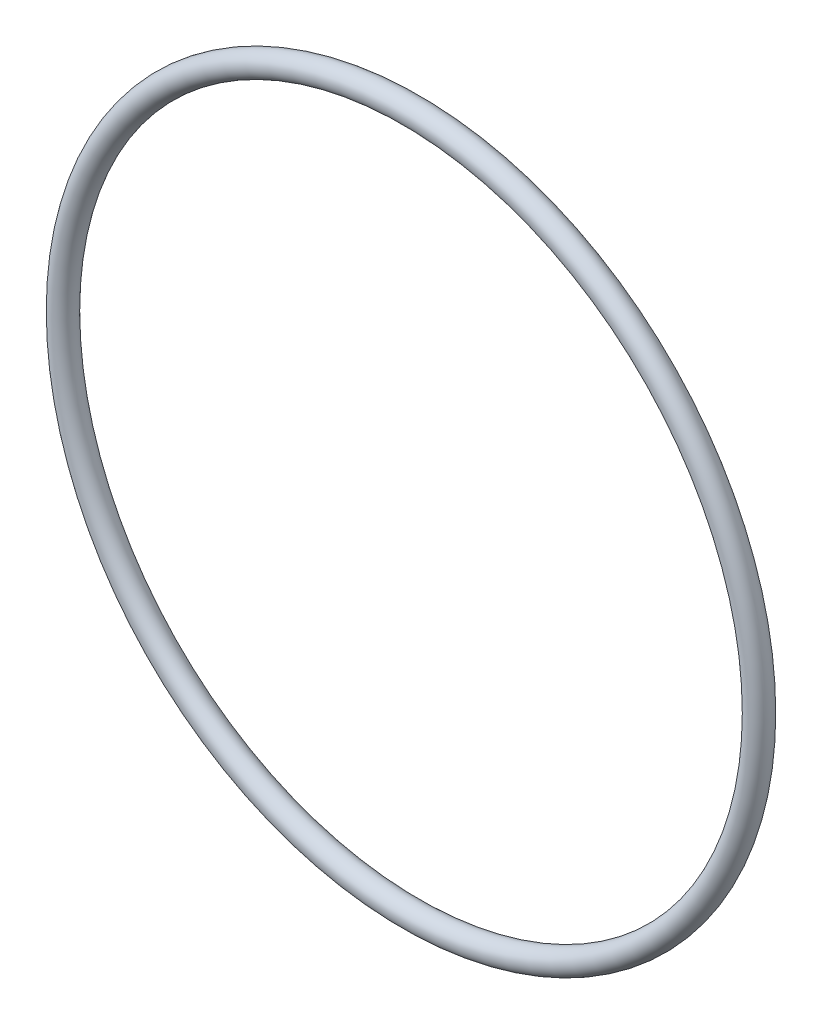
ISO-10303-21;
HEADER;
FILE_DESCRIPTION(('STEP AP214'),'2;1');
FILE_NAME('part.step','',(''),(''),'','','');
FILE_SCHEMA(('AUTOMOTIVE_DESIGN { 1 0 10303 214 1 1 1 1 }'));
ENDSEC;
DATA;
#1=APPLICATION_CONTEXT('core data for automotive mechanical design processes');
#2=APPLICATION_PROTOCOL_DEFINITION('international standard','automotive_design',2000,#1);
#3=PRODUCT_CONTEXT('',#1,'mechanical');
#4=PRODUCT('Part','Part','',(#3));
#5=PRODUCT_RELATED_PRODUCT_CATEGORY('part','',(#4));
#6=PRODUCT_DEFINITION_FORMATION('','',#4);
#7=PRODUCT_DEFINITION_CONTEXT('part definition',#1,'design');
#8=PRODUCT_DEFINITION('design','',#6,#7);
#9=PRODUCT_DEFINITION_SHAPE('','',#8);
#10=(LENGTH_UNIT() NAMED_UNIT(*) SI_UNIT(.MILLI.,.METRE.));
#11=(NAMED_UNIT(*) PLANE_ANGLE_UNIT() SI_UNIT($,.RADIAN.));
#12=(NAMED_UNIT(*) SI_UNIT($,.STERADIAN.) SOLID_ANGLE_UNIT());
#13=UNCERTAINTY_MEASURE_WITH_UNIT(LENGTH_MEASURE(1.E-05),#10,'distance_accuracy_value','');
#14=(GEOMETRIC_REPRESENTATION_CONTEXT(3) GLOBAL_UNCERTAINTY_ASSIGNED_CONTEXT((#13)) GLOBAL_UNIT_ASSIGNED_CONTEXT((#10,
#11,#12)) REPRESENTATION_CONTEXT('',''));
#15=CARTESIAN_POINT('',(0.,0.,0.));
#16=DIRECTION('',(0.,0.,1.));
#17=DIRECTION('',(1.,0.,0.));
#18=AXIS2_PLACEMENT_3D('',#15,#16,#17);
#19=CARTESIAN_POINT('',(0.,0.,0.));
#20=DIRECTION('',(0.,0.,1.));
#21=DIRECTION('',(1.,0.,0.));
#22=AXIS2_PLACEMENT_3D('',#19,#20,#21);
#23=TOROIDAL_SURFACE('',#22,26.1493,0.888999999999996);
#24=CARTESIAN_POINT('',(27.0383,0.,0.));
#25=VERTEX_POINT('',#24);
#26=VERTEX_LOOP('',#25);
#27=FACE_BOUND('',#26,.T.);
#28=ADVANCED_FACE('F33',(#27),#23,.T.);
#29=CLOSED_SHELL('',(#28));
#30=MANIFOLD_SOLID_BREP('B2',#29);
#31=ADVANCED_BREP_SHAPE_REPRESENTATION('',(#18,#30),#14);
#32=SHAPE_DEFINITION_REPRESENTATION(#9,#31);
ENDSEC;
END-ISO-10303-21;
